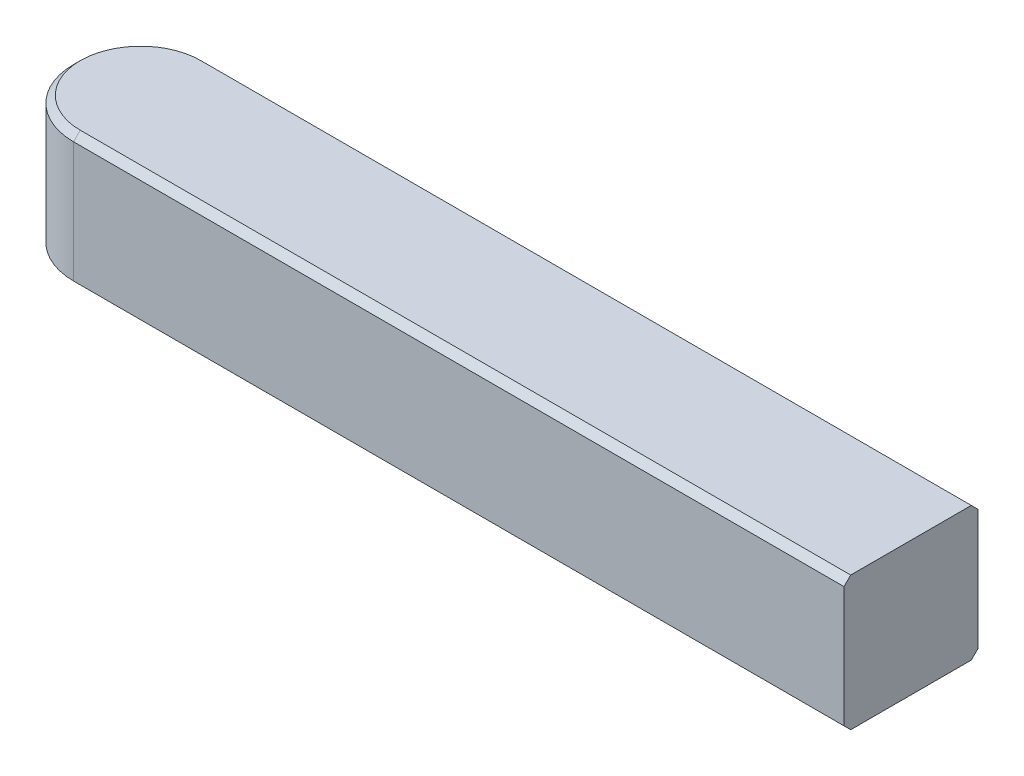
ISO-10303-21;
HEADER;
FILE_DESCRIPTION(('STEP AP214'),'2;1');
FILE_NAME('part.step','',(''),(''),'','','');
FILE_SCHEMA(('AUTOMOTIVE_DESIGN { 1 0 10303 214 1 1 1 1 }'));
ENDSEC;
DATA;
#1=APPLICATION_CONTEXT('core data for automotive mechanical design processes');
#2=APPLICATION_PROTOCOL_DEFINITION('international standard','automotive_design',2000,#1);
#3=PRODUCT_CONTEXT('',#1,'mechanical');
#4=PRODUCT('Part','Part','',(#3));
#5=PRODUCT_RELATED_PRODUCT_CATEGORY('part','',(#4));
#6=PRODUCT_DEFINITION_FORMATION('','',#4);
#7=PRODUCT_DEFINITION_CONTEXT('part definition',#1,'design');
#8=PRODUCT_DEFINITION('design','',#6,#7);
#9=PRODUCT_DEFINITION_SHAPE('','',#8);
#10=(LENGTH_UNIT() NAMED_UNIT(*) SI_UNIT(.MILLI.,.METRE.));
#11=(NAMED_UNIT(*) PLANE_ANGLE_UNIT() SI_UNIT($,.RADIAN.));
#12=(NAMED_UNIT(*) SI_UNIT($,.STERADIAN.) SOLID_ANGLE_UNIT());
#13=UNCERTAINTY_MEASURE_WITH_UNIT(LENGTH_MEASURE(1.E-05),#10,'distance_accuracy_value','');
#14=(GEOMETRIC_REPRESENTATION_CONTEXT(3) GLOBAL_UNCERTAINTY_ASSIGNED_CONTEXT((#13)) GLOBAL_UNIT_ASSIGNED_CONTEXT((#10,
#11,#12)) REPRESENTATION_CONTEXT('',''));
#15=CARTESIAN_POINT('',(0.,0.,0.));
#16=DIRECTION('',(0.,0.,1.));
#17=DIRECTION('',(1.,0.,0.));
#18=AXIS2_PLACEMENT_3D('',#15,#16,#17);
#19=CARTESIAN_POINT('',(2.,0.,0.));
#20=DIRECTION('',(0.,-1.,0.));
#21=DIRECTION('',(0.,0.,-1.));
#22=AXIS2_PLACEMENT_3D('',#19,#20,#21);
#23=CYLINDRICAL_SURFACE('',#22,2.);
#24=DIRECTION('',(0.,-1.,0.));
#25=VECTOR('',#24,1.);
#26=CARTESIAN_POINT('',(2.,4.,-2.));
#27=LINE('',#26,#25);
#28=CARTESIAN_POINT('',(2.,0.200000000000002,-2.));
#29=VERTEX_POINT('',#28);
#30=CARTESIAN_POINT('',(2.,3.8,-2.));
#31=VERTEX_POINT('',#30);
#32=EDGE_CURVE('E129',#29,#31,#27,.F.);
#33=ORIENTED_EDGE('',*,*,#32,.F.);
#34=CARTESIAN_POINT('',(2.,0.200000000000002,0.));
#35=DIRECTION('',(0.,1.,0.));
#36=DIRECTION('',(0.,0.,1.));
#37=AXIS2_PLACEMENT_3D('',#34,#35,#36);
#38=CIRCLE('',#37,2.);
#39=CARTESIAN_POINT('',(2.,0.200000000000002,2.));
#40=VERTEX_POINT('',#39);
#41=EDGE_CURVE('E115',#29,#40,#38,.T.);
#42=ORIENTED_EDGE('',*,*,#41,.T.);
#43=DIRECTION('',(0.,-1.,0.));
#44=VECTOR('',#43,1.);
#45=CARTESIAN_POINT('',(2.,4.,2.));
#46=LINE('',#45,#44);
#47=CARTESIAN_POINT('',(2.,3.8,2.));
#48=VERTEX_POINT('',#47);
#49=EDGE_CURVE('E137',#48,#40,#46,.T.);
#50=ORIENTED_EDGE('',*,*,#49,.F.);
#51=CARTESIAN_POINT('',(2.,3.8,0.));
#52=DIRECTION('',(0.,1.,0.));
#53=DIRECTION('',(0.,0.,1.));
#54=AXIS2_PLACEMENT_3D('',#51,#52,#53);
#55=CIRCLE('',#54,2.);
#56=EDGE_CURVE('E123',#48,#31,#55,.F.);
#57=ORIENTED_EDGE('',*,*,#56,.T.);
#58=EDGE_LOOP('',(#33,#42,#50,#57));
#59=FACE_BOUND('',#58,.T.);
#60=ADVANCED_FACE('F36',(#59),#23,.T.);
#61=CARTESIAN_POINT('',(0.,4.,2.));
#62=DIRECTION('',(0.,0.,-1.));
#63=DIRECTION('',(-1.,0.,0.));
#64=AXIS2_PLACEMENT_3D('',#61,#62,#63);
#65=PLANE('',#64);
#66=ORIENTED_EDGE('',*,*,#49,.T.);
#67=DIRECTION('',(1.,0.,0.));
#68=VECTOR('',#67,1.);
#69=CARTESIAN_POINT('',(0.,0.200000000000002,2.));
#70=LINE('',#69,#68);
#71=CARTESIAN_POINT('',(25.,0.200000000000003,2.));
#72=VERTEX_POINT('',#71);
#73=EDGE_CURVE('E160',#40,#72,#70,.T.);
#74=ORIENTED_EDGE('',*,*,#73,.T.);
#75=DIRECTION('',(0.,-1.,0.));
#76=VECTOR('',#75,1.);
#77=CARTESIAN_POINT('',(25.,4.,2.));
#78=LINE('',#77,#76);
#79=CARTESIAN_POINT('',(25.,3.8,2.));
#80=VERTEX_POINT('',#79);
#81=EDGE_CURVE('E138',#80,#72,#78,.T.);
#82=ORIENTED_EDGE('',*,*,#81,.F.);
#83=DIRECTION('',(-1.,0.,0.));
#84=VECTOR('',#83,1.);
#85=CARTESIAN_POINT('',(2.,3.8,2.));
#86=LINE('',#85,#84);
#87=EDGE_CURVE('E122',#80,#48,#86,.T.);
#88=ORIENTED_EDGE('',*,*,#87,.T.);
#89=EDGE_LOOP('',(#66,#74,#82,#88));
#90=FACE_BOUND('',#89,.T.);
#91=ADVANCED_FACE('F192',(#90),#65,.F.);
#92=CARTESIAN_POINT('',(25.,4.,-2.));
#93=DIRECTION('',(-1.,0.,0.));
#94=DIRECTION('',(0.,0.,1.));
#95=AXIS2_PLACEMENT_3D('',#92,#93,#94);
#96=PLANE('',#95);
#97=DIRECTION('',(0.,0.,-1.));
#98=VECTOR('',#97,1.);
#99=CARTESIAN_POINT('',(25.,0.,-2.));
#100=LINE('',#99,#98);
#101=CARTESIAN_POINT('',(25.,0.,1.79999999999999));
#102=VERTEX_POINT('',#101);
#103=CARTESIAN_POINT('',(25.,0.,-1.8));
#104=VERTEX_POINT('',#103);
#105=EDGE_CURVE('E164',#102,#104,#100,.T.);
#106=ORIENTED_EDGE('',*,*,#105,.T.);
#107=DIRECTION('',(0.,-0.707106781186548,0.707106781186548));
#108=VECTOR('',#107,1.);
#109=CARTESIAN_POINT('',(25.,0.200000000000002,-2.));
#110=LINE('',#109,#108);
#111=CARTESIAN_POINT('',(25.,0.200000000000003,-2.));
#112=VERTEX_POINT('',#111);
#113=EDGE_CURVE('E156',#104,#112,#110,.F.);
#114=ORIENTED_EDGE('',*,*,#113,.T.);
#115=DIRECTION('',(0.,-1.,0.));
#116=VECTOR('',#115,1.);
#117=CARTESIAN_POINT('',(25.,4.,-2.));
#118=LINE('',#117,#116);
#119=CARTESIAN_POINT('',(25.,3.8,-2.));
#120=VERTEX_POINT('',#119);
#121=EDGE_CURVE('E132',#120,#112,#118,.T.);
#122=ORIENTED_EDGE('',*,*,#121,.F.);
#123=DIRECTION('',(0.,0.707106781186548,0.707106781186548));
#124=VECTOR('',#123,1.);
#125=CARTESIAN_POINT('',(25.,4.,-1.8));
#126=LINE('',#125,#124);
#127=CARTESIAN_POINT('',(25.,4.,-1.8));
#128=VERTEX_POINT('',#127);
#129=EDGE_CURVE('E150',#120,#128,#126,.T.);
#130=ORIENTED_EDGE('',*,*,#129,.T.);
#131=DIRECTION('',(0.,0.,-1.));
#132=VECTOR('',#131,1.);
#133=CARTESIAN_POINT('',(25.,4.,-2.));
#134=LINE('',#133,#132);
#135=CARTESIAN_POINT('',(25.,4.,1.79999999999999));
#136=VERTEX_POINT('',#135);
#137=EDGE_CURVE('E179',#136,#128,#134,.T.);
#138=ORIENTED_EDGE('',*,*,#137,.F.);
#139=DIRECTION('',(0.,-0.707106781186548,0.707106781186548));
#140=VECTOR('',#139,1.);
#141=CARTESIAN_POINT('',(25.,4.,1.79999999999999));
#142=LINE('',#141,#140);
#143=EDGE_CURVE('E152',#136,#80,#142,.T.);
#144=ORIENTED_EDGE('',*,*,#143,.T.);
#145=ORIENTED_EDGE('',*,*,#81,.T.);
#146=DIRECTION('',(0.,0.707106781186548,0.707106781186548));
#147=VECTOR('',#146,1.);
#148=CARTESIAN_POINT('',(25.,0.200000000000005,2.));
#149=LINE('',#148,#147);
#150=EDGE_CURVE('E154',#72,#102,#149,.F.);
#151=ORIENTED_EDGE('',*,*,#150,.T.);
#152=EDGE_LOOP('',(#106,#114,#122,#130,#138,#144,#145,#151));
#153=FACE_BOUND('',#152,.T.);
#154=ADVANCED_FACE('F177',(#153),#96,.F.);
#155=CARTESIAN_POINT('',(0.,4.,-2.));
#156=DIRECTION('',(0.,0.,1.));
#157=DIRECTION('',(1.,0.,0.));
#158=AXIS2_PLACEMENT_3D('',#155,#156,#157);
#159=PLANE('',#158);
#160=ORIENTED_EDGE('',*,*,#121,.T.);
#161=DIRECTION('',(-1.,0.,0.));
#162=VECTOR('',#161,1.);
#163=CARTESIAN_POINT('',(0.,0.200000000000002,-2.));
#164=LINE('',#163,#162);
#165=EDGE_CURVE('E108',#112,#29,#164,.T.);
#166=ORIENTED_EDGE('',*,*,#165,.T.);
#167=ORIENTED_EDGE('',*,*,#32,.T.);
#168=DIRECTION('',(1.,0.,0.));
#169=VECTOR('',#168,1.);
#170=CARTESIAN_POINT('',(25.,3.8,-2.));
#171=LINE('',#170,#169);
#172=EDGE_CURVE('E134',#31,#120,#171,.T.);
#173=ORIENTED_EDGE('',*,*,#172,.T.);
#174=EDGE_LOOP('',(#160,#166,#167,#173));
#175=FACE_BOUND('',#174,.T.);
#176=ADVANCED_FACE('F128',(#175),#159,.F.);
#177=CARTESIAN_POINT('',(0.,4.,0.));
#178=DIRECTION('',(0.,1.,0.));
#179=DIRECTION('',(0.,0.,1.));
#180=AXIS2_PLACEMENT_3D('',#177,#178,#179);
#181=PLANE('',#180);
#182=CARTESIAN_POINT('',(2.,4.,0.));
#183=DIRECTION('',(0.,1.,0.));
#184=DIRECTION('',(0.,0.,1.));
#185=AXIS2_PLACEMENT_3D('',#182,#183,#184);
#186=CIRCLE('',#185,1.8);
#187=CARTESIAN_POINT('',(2.,4.,-1.79999999999999));
#188=VERTEX_POINT('',#187);
#189=CARTESIAN_POINT('',(2.,4.,1.8));
#190=VERTEX_POINT('',#189);
#191=EDGE_CURVE('E52',#188,#190,#186,.T.);
#192=ORIENTED_EDGE('',*,*,#191,.T.);
#193=DIRECTION('',(1.,0.,0.));
#194=VECTOR('',#193,1.);
#195=CARTESIAN_POINT('',(25.,4.,1.79999999999999));
#196=LINE('',#195,#194);
#197=EDGE_CURVE('E11',#190,#136,#196,.T.);
#198=ORIENTED_EDGE('',*,*,#197,.T.);
#199=ORIENTED_EDGE('',*,*,#137,.T.);
#200=DIRECTION('',(-1.,0.,0.));
#201=VECTOR('',#200,1.);
#202=CARTESIAN_POINT('',(2.,4.,-1.8));
#203=LINE('',#202,#201);
#204=EDGE_CURVE('E45',#128,#188,#203,.T.);
#205=ORIENTED_EDGE('',*,*,#204,.T.);
#206=EDGE_LOOP('',(#192,#198,#199,#205));
#207=FACE_BOUND('',#206,.T.);
#208=ADVANCED_FACE('F194',(#207),#181,.T.);
#209=CARTESIAN_POINT('',(0.,0.,0.));
#210=DIRECTION('',(0.,1.,0.));
#211=DIRECTION('',(0.,0.,1.));
#212=AXIS2_PLACEMENT_3D('',#209,#210,#211);
#213=PLANE('',#212);
#214=CARTESIAN_POINT('',(2.,0.,0.));
#215=DIRECTION('',(0.,1.,0.));
#216=DIRECTION('',(0.,0.,1.));
#217=AXIS2_PLACEMENT_3D('',#214,#215,#216);
#218=CIRCLE('',#217,1.8);
#219=CARTESIAN_POINT('',(2.,0.,1.8));
#220=VERTEX_POINT('',#219);
#221=CARTESIAN_POINT('',(2.,0.,-1.8));
#222=VERTEX_POINT('',#221);
#223=EDGE_CURVE('E147',#220,#222,#218,.F.);
#224=ORIENTED_EDGE('',*,*,#223,.T.);
#225=DIRECTION('',(1.,0.,0.));
#226=VECTOR('',#225,1.);
#227=CARTESIAN_POINT('',(0.,0.,-1.8));
#228=LINE('',#227,#226);
#229=EDGE_CURVE('E109',#222,#104,#228,.T.);
#230=ORIENTED_EDGE('',*,*,#229,.T.);
#231=ORIENTED_EDGE('',*,*,#105,.F.);
#232=DIRECTION('',(-1.,0.,0.));
#233=VECTOR('',#232,1.);
#234=CARTESIAN_POINT('',(0.,0.,1.8));
#235=LINE('',#234,#233);
#236=EDGE_CURVE('E133',#102,#220,#235,.T.);
#237=ORIENTED_EDGE('',*,*,#236,.T.);
#238=EDGE_LOOP('',(#224,#230,#231,#237));
#239=FACE_BOUND('',#238,.T.);
#240=ADVANCED_FACE('F186',(#239),#213,.F.);
#241=CARTESIAN_POINT('',(0.,0.200000000000002,2.));
#242=DIRECTION('',(0.,0.707106781186547,-0.707106781186547));
#243=DIRECTION('',(1.,0.,0.));
#244=AXIS2_PLACEMENT_3D('',#241,#242,#243);
#245=PLANE('',#244);
#246=ORIENTED_EDGE('',*,*,#150,.F.);
#247=ORIENTED_EDGE('',*,*,#73,.F.);
#248=DIRECTION('',(0.,0.707106781186547,0.707106781186547));
#249=VECTOR('',#248,1.);
#250=CARTESIAN_POINT('',(2.,0.,1.8));
#251=LINE('',#250,#249);
#252=EDGE_CURVE('E112',#220,#40,#251,.T.);
#253=ORIENTED_EDGE('',*,*,#252,.F.);
#254=ORIENTED_EDGE('',*,*,#236,.F.);
#255=EDGE_LOOP('',(#246,#247,#253,#254));
#256=FACE_BOUND('',#255,.T.);
#257=ADVANCED_FACE('F188',(#256),#245,.F.);
#258=CARTESIAN_POINT('',(2.,0.,0.));
#259=DIRECTION('',(0.,1.,0.));
#260=DIRECTION('',(0.,0.,1.));
#261=AXIS2_PLACEMENT_3D('',#258,#259,#260);
#262=CONICAL_SURFACE('',#261,1.8,0.785398163397448);
#263=ORIENTED_EDGE('',*,*,#252,.T.);
#264=ORIENTED_EDGE('',*,*,#41,.F.);
#265=DIRECTION('',(0.,0.707106781186547,-0.707106781186548));
#266=VECTOR('',#265,1.);
#267=CARTESIAN_POINT('',(2.,0.,-1.8));
#268=LINE('',#267,#266);
#269=EDGE_CURVE('E103',#222,#29,#268,.T.);
#270=ORIENTED_EDGE('',*,*,#269,.F.);
#271=ORIENTED_EDGE('',*,*,#223,.F.);
#272=EDGE_LOOP('',(#263,#264,#270,#271));
#273=FACE_BOUND('',#272,.T.);
#274=ADVANCED_FACE('F116',(#273),#262,.T.);
#275=CARTESIAN_POINT('',(0.,0.200000000000002,-2.));
#276=DIRECTION('',(0.,0.707106781186547,0.707106781186547));
#277=DIRECTION('',(-1.,0.,0.));
#278=AXIS2_PLACEMENT_3D('',#275,#276,#277);
#279=PLANE('',#278);
#280=ORIENTED_EDGE('',*,*,#113,.F.);
#281=ORIENTED_EDGE('',*,*,#229,.F.);
#282=ORIENTED_EDGE('',*,*,#269,.T.);
#283=ORIENTED_EDGE('',*,*,#165,.F.);
#284=EDGE_LOOP('',(#280,#281,#282,#283));
#285=FACE_BOUND('',#284,.T.);
#286=ADVANCED_FACE('F106',(#285),#279,.F.);
#287=CARTESIAN_POINT('',(0.,4.,-1.8));
#288=DIRECTION('',(0.,0.707106781186547,-0.707106781186547));
#289=DIRECTION('',(1.,0.,0.));
#290=AXIS2_PLACEMENT_3D('',#287,#288,#289);
#291=PLANE('',#290);
#292=ORIENTED_EDGE('',*,*,#129,.F.);
#293=ORIENTED_EDGE('',*,*,#172,.F.);
#294=DIRECTION('',(0.,-0.707106781186547,-0.707106781186547));
#295=VECTOR('',#294,1.);
#296=CARTESIAN_POINT('',(2.,4.,-1.8));
#297=LINE('',#296,#295);
#298=EDGE_CURVE('E40',#188,#31,#297,.T.);
#299=ORIENTED_EDGE('',*,*,#298,.F.);
#300=ORIENTED_EDGE('',*,*,#204,.F.);
#301=EDGE_LOOP('',(#292,#293,#299,#300));
#302=FACE_BOUND('',#301,.T.);
#303=ADVANCED_FACE('F38',(#302),#291,.T.);
#304=CARTESIAN_POINT('',(2.,4.,0.));
#305=DIRECTION('',(0.,-1.,0.));
#306=DIRECTION('',(0.,0.,-1.));
#307=AXIS2_PLACEMENT_3D('',#304,#305,#306);
#308=CONICAL_SURFACE('',#307,1.8,0.785398163397448);
#309=ORIENTED_EDGE('',*,*,#298,.T.);
#310=ORIENTED_EDGE('',*,*,#56,.F.);
#311=DIRECTION('',(0.,-0.707106781186547,0.707106781186548));
#312=VECTOR('',#311,1.);
#313=CARTESIAN_POINT('',(2.,4.,1.8));
#314=LINE('',#313,#312);
#315=EDGE_CURVE('E165',#190,#48,#314,.T.);
#316=ORIENTED_EDGE('',*,*,#315,.F.);
#317=ORIENTED_EDGE('',*,*,#191,.F.);
#318=EDGE_LOOP('',(#309,#310,#316,#317));
#319=FACE_BOUND('',#318,.T.);
#320=ADVANCED_FACE('F172',(#319),#308,.T.);
#321=CARTESIAN_POINT('',(0.,4.,1.8));
#322=DIRECTION('',(0.,0.707106781186547,0.707106781186547));
#323=DIRECTION('',(-1.,0.,0.));
#324=AXIS2_PLACEMENT_3D('',#321,#322,#323);
#325=PLANE('',#324);
#326=ORIENTED_EDGE('',*,*,#315,.T.);
#327=ORIENTED_EDGE('',*,*,#87,.F.);
#328=ORIENTED_EDGE('',*,*,#143,.F.);
#329=ORIENTED_EDGE('',*,*,#197,.F.);
#330=EDGE_LOOP('',(#326,#327,#328,#329));
#331=FACE_BOUND('',#330,.T.);
#332=ADVANCED_FACE('F193',(#331),#325,.T.);
#333=CLOSED_SHELL('',(#60,#91,#154,#176,#208,#240,#257,#274,#286,#303,#320,#332));
#334=MANIFOLD_SOLID_BREP('B2',#333);
#335=ADVANCED_BREP_SHAPE_REPRESENTATION('',(#18,#334),#14);
#336=SHAPE_DEFINITION_REPRESENTATION(#9,#335);
ENDSEC;
END-ISO-10303-21;
